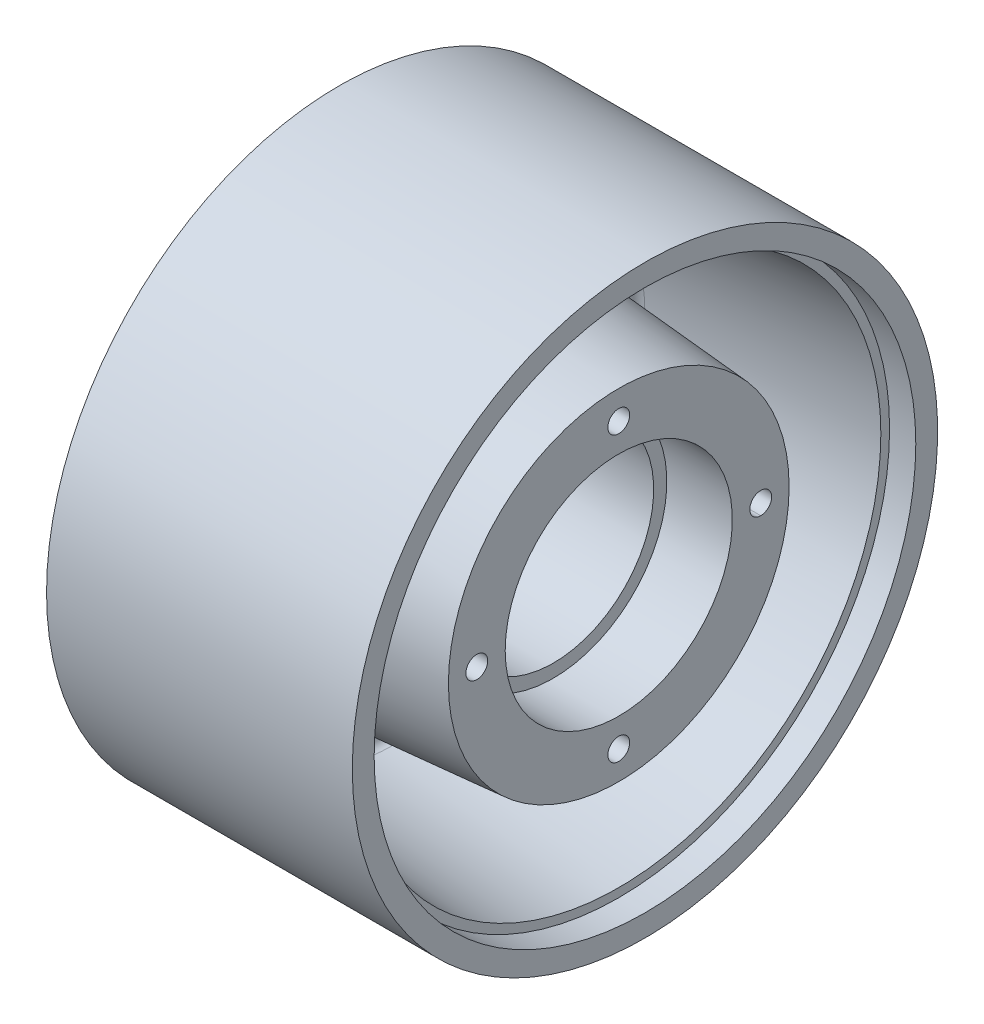
ISO-10303-21;
HEADER;
FILE_DESCRIPTION(('STEP AP214'),'2;1');
FILE_NAME('part.step','',(''),(''),'','','');
FILE_SCHEMA(('AUTOMOTIVE_DESIGN { 1 0 10303 214 1 1 1 1 }'));
ENDSEC;
DATA;
#1=APPLICATION_CONTEXT('core data for automotive mechanical design processes');
#2=APPLICATION_PROTOCOL_DEFINITION('international standard','automotive_design',2000,#1);
#3=PRODUCT_CONTEXT('',#1,'mechanical');
#4=PRODUCT('Part','Part','',(#3));
#5=PRODUCT_RELATED_PRODUCT_CATEGORY('part','',(#4));
#6=PRODUCT_DEFINITION_FORMATION('','',#4);
#7=PRODUCT_DEFINITION_CONTEXT('part definition',#1,'design');
#8=PRODUCT_DEFINITION('design','',#6,#7);
#9=PRODUCT_DEFINITION_SHAPE('','',#8);
#10=(LENGTH_UNIT() NAMED_UNIT(*) SI_UNIT(.MILLI.,.METRE.));
#11=(NAMED_UNIT(*) PLANE_ANGLE_UNIT() SI_UNIT($,.RADIAN.));
#12=(NAMED_UNIT(*) SI_UNIT($,.STERADIAN.) SOLID_ANGLE_UNIT());
#13=UNCERTAINTY_MEASURE_WITH_UNIT(LENGTH_MEASURE(1.E-05),#10,'distance_accuracy_value','');
#14=(GEOMETRIC_REPRESENTATION_CONTEXT(3) GLOBAL_UNCERTAINTY_ASSIGNED_CONTEXT((#13)) GLOBAL_UNIT_ASSIGNED_CONTEXT((#10,
#11,#12)) REPRESENTATION_CONTEXT('',''));
#15=CARTESIAN_POINT('',(0.,0.,0.));
#16=DIRECTION('',(0.,0.,1.));
#17=DIRECTION('',(1.,0.,0.));
#18=AXIS2_PLACEMENT_3D('',#15,#16,#17);
#19=CARTESIAN_POINT('',(64.,39.,0.));
#20=DIRECTION('',(-1.,0.,0.));
#21=DIRECTION('',(0.,0.,1.));
#22=AXIS2_PLACEMENT_3D('',#19,#20,#21);
#23=PLANE('',#22);
#24=CARTESIAN_POINT('',(64.,0.,0.));
#25=DIRECTION('',(-1.,0.,0.));
#26=DIRECTION('',(0.,0.,1.));
#27=AXIS2_PLACEMENT_3D('',#24,#25,#26);
#28=CIRCLE('',#27,26.);
#29=CARTESIAN_POINT('',(64.,0.,26.));
#30=VERTEX_POINT('',#29);
#31=EDGE_CURVE('E281',#30,#30,#28,.T.);
#32=ORIENTED_EDGE('',*,*,#31,.T.);
#33=EDGE_LOOP('',(#32));
#34=FACE_BOUND('',#33,.T.);
#35=CARTESIAN_POINT('',(64.,0.,0.));
#36=DIRECTION('',(-1.,0.,0.));
#37=DIRECTION('',(0.,0.,1.));
#38=AXIS2_PLACEMENT_3D('',#35,#36,#37);
#39=CIRCLE('',#38,39.);
#40=CARTESIAN_POINT('',(64.,0.,39.));
#41=VERTEX_POINT('',#40);
#42=EDGE_CURVE('E283',#41,#41,#39,.T.);
#43=ORIENTED_EDGE('',*,*,#42,.F.);
#44=EDGE_LOOP('',(#43));
#45=FACE_BOUND('',#44,.T.);
#46=CARTESIAN_POINT('',(64.,32.5,0.));
#47=DIRECTION('',(1.,0.,0.));
#48=DIRECTION('',(0.,0.,-1.));
#49=AXIS2_PLACEMENT_3D('',#46,#47,#48);
#50=CIRCLE('',#49,2.49999999999999);
#51=CARTESIAN_POINT('',(64.,32.5,-2.49999999999999));
#52=VERTEX_POINT('',#51);
#53=EDGE_CURVE('E248',#52,#52,#50,.T.);
#54=ORIENTED_EDGE('',*,*,#53,.F.);
#55=EDGE_LOOP('',(#54));
#56=FACE_BOUND('',#55,.T.);
#57=CARTESIAN_POINT('',(64.,-32.4705621886959,0.));
#58=DIRECTION('',(1.,0.,0.));
#59=DIRECTION('',(0.,0.,-1.));
#60=AXIS2_PLACEMENT_3D('',#57,#58,#59);
#61=CIRCLE('',#60,2.49999999999999);
#62=CARTESIAN_POINT('',(64.,-32.4705621886959,-2.49999999999999));
#63=VERTEX_POINT('',#62);
#64=EDGE_CURVE('E242',#63,#63,#61,.T.);
#65=ORIENTED_EDGE('',*,*,#64,.F.);
#66=EDGE_LOOP('',(#65));
#67=FACE_BOUND('',#66,.T.);
#68=CARTESIAN_POINT('',(64.,0.,32.5));
#69=DIRECTION('',(1.,0.,0.));
#70=DIRECTION('',(0.,0.,-1.));
#71=AXIS2_PLACEMENT_3D('',#68,#69,#70);
#72=CIRCLE('',#71,2.49999999999999);
#73=CARTESIAN_POINT('',(64.,0.,30.));
#74=VERTEX_POINT('',#73);
#75=EDGE_CURVE('E122',#74,#74,#72,.T.);
#76=ORIENTED_EDGE('',*,*,#75,.F.);
#77=EDGE_LOOP('',(#76));
#78=FACE_BOUND('',#77,.T.);
#79=CARTESIAN_POINT('',(64.,0.,-32.5));
#80=DIRECTION('',(1.,0.,0.));
#81=DIRECTION('',(0.,0.,-1.));
#82=AXIS2_PLACEMENT_3D('',#79,#80,#81);
#83=CIRCLE('',#82,2.49999999999999);
#84=CARTESIAN_POINT('',(64.,2.4999998565431,-32.5008469264674));
#85=VERTEX_POINT('',#84);
#86=CARTESIAN_POINT('',(64.,-2.4999998565431,-32.5008469264674));
#87=VERTEX_POINT('',#86);
#88=EDGE_CURVE('E110',#85,#87,#83,.T.);
#89=ORIENTED_EDGE('',*,*,#88,.F.);
#90=CARTESIAN_POINT('',(64.,0.,-32.5016938529361));
#91=DIRECTION('',(1.,0.,0.));
#92=DIRECTION('',(0.,0.,-1.));
#93=AXIS2_PLACEMENT_3D('',#90,#91,#92);
#94=CIRCLE('',#93,2.49999999999999);
#95=EDGE_CURVE('E222',#87,#85,#94,.T.);
#96=ORIENTED_EDGE('',*,*,#95,.F.);
#97=EDGE_LOOP('',(#89,#96));
#98=FACE_BOUND('',#97,.T.);
#99=ADVANCED_FACE('F38',(#34,#45,#56,#67,#78,#98),#23,.F.);
#100=CARTESIAN_POINT('',(70.,67.,0.));
#101=DIRECTION('',(-1.,0.,0.));
#102=DIRECTION('',(0.,0.,1.));
#103=AXIS2_PLACEMENT_3D('',#100,#101,#102);
#104=PLANE('',#103);
#105=CARTESIAN_POINT('',(70.,0.,0.));
#106=DIRECTION('',(-1.,0.,0.));
#107=DIRECTION('',(0.,0.,1.));
#108=AXIS2_PLACEMENT_3D('',#105,#106,#107);
#109=CIRCLE('',#108,67.);
#110=CARTESIAN_POINT('',(70.,0.,67.));
#111=VERTEX_POINT('',#110);
#112=EDGE_CURVE('E254',#111,#111,#109,.T.);
#113=ORIENTED_EDGE('',*,*,#112,.F.);
#114=EDGE_LOOP('',(#113));
#115=FACE_BOUND('',#114,.T.);
#116=CARTESIAN_POINT('',(70.,0.,0.));
#117=DIRECTION('',(-1.,0.,0.));
#118=DIRECTION('',(0.,0.,1.));
#119=AXIS2_PLACEMENT_3D('',#116,#117,#118);
#120=CIRCLE('',#119,62.);
#121=CARTESIAN_POINT('',(70.,0.,62.));
#122=VERTEX_POINT('',#121);
#123=EDGE_CURVE('E212',#122,#122,#120,.T.);
#124=ORIENTED_EDGE('',*,*,#123,.T.);
#125=EDGE_LOOP('',(#124));
#126=FACE_BOUND('',#125,.T.);
#127=ADVANCED_FACE('F154',(#115,#126),#104,.F.);
#128=CARTESIAN_POINT('',(-33.5154853004459,0.,0.));
#129=DIRECTION('',(-1.,0.,0.));
#130=DIRECTION('',(0.,0.,1.));
#131=AXIS2_PLACEMENT_3D('',#128,#129,#130);
#132=CYLINDRICAL_SURFACE('',#131,62.);
#133=ORIENTED_EDGE('',*,*,#123,.F.);
#134=EDGE_LOOP('',(#133));
#135=FACE_BOUND('',#134,.T.);
#136=CARTESIAN_POINT('',(64.,0.,0.));
#137=DIRECTION('',(-1.,0.,0.));
#138=DIRECTION('',(0.,0.,1.));
#139=AXIS2_PLACEMENT_3D('',#136,#137,#138);
#140=CIRCLE('',#139,62.);
#141=CARTESIAN_POINT('',(64.,0.,62.));
#142=VERTEX_POINT('',#141);
#143=EDGE_CURVE('E289',#142,#142,#140,.T.);
#144=ORIENTED_EDGE('',*,*,#143,.T.);
#145=EDGE_LOOP('',(#144));
#146=FACE_BOUND('',#145,.T.);
#147=ADVANCED_FACE('F160',(#135,#146),#132,.F.);
#148=CARTESIAN_POINT('',(64.,62.,0.));
#149=DIRECTION('',(-1.,0.,0.));
#150=DIRECTION('',(0.,0.,1.));
#151=AXIS2_PLACEMENT_3D('',#148,#149,#150);
#152=PLANE('',#151);
#153=ORIENTED_EDGE('',*,*,#143,.F.);
#154=EDGE_LOOP('',(#153));
#155=FACE_BOUND('',#154,.T.);
#156=CARTESIAN_POINT('',(64.,0.,0.));
#157=DIRECTION('',(-1.,0.,0.));
#158=DIRECTION('',(0.,0.,1.));
#159=AXIS2_PLACEMENT_3D('',#156,#157,#158);
#160=CIRCLE('',#159,60.);
#161=CARTESIAN_POINT('',(64.,0.,60.));
#162=VERTEX_POINT('',#161);
#163=EDGE_CURVE('E286',#162,#162,#160,.T.);
#164=ORIENTED_EDGE('',*,*,#163,.T.);
#165=EDGE_LOOP('',(#164));
#166=FACE_BOUND('',#165,.T.);
#167=ADVANCED_FACE('F180',(#155,#166),#152,.F.);
#168=CARTESIAN_POINT('',(12.,0.,0.));
#169=DIRECTION('',(1.,0.,0.));
#170=DIRECTION('',(0.,0.,-1.));
#171=AXIS2_PLACEMENT_3D('',#168,#169,#170);
#172=CONICAL_SURFACE('',#171,56.,0.0767718912697781);
#173=CARTESIAN_POINT('',(13.8466070022305,0.,0.));
#174=DIRECTION('',(1.,0.,0.));
#175=DIRECTION('',(0.,0.,-1.));
#176=AXIS2_PLACEMENT_3D('',#173,#174,#175);
#177=CIRCLE('',#176,56.1420466924793);
#178=CARTESIAN_POINT('',(13.8466070022305,0.,-56.1420466924793));
#179=VERTEX_POINT('',#178);
#180=EDGE_CURVE('E209',#179,#179,#177,.F.);
#181=ORIENTED_EDGE('',*,*,#180,.T.);
#182=EDGE_LOOP('',(#181));
#183=FACE_BOUND('',#182,.T.);
#184=ORIENTED_EDGE('',*,*,#163,.F.);
#185=EDGE_LOOP('',(#184));
#186=FACE_BOUND('',#185,.T.);
#187=ADVANCED_FACE('F176',(#183,#186),#172,.F.);
#188=CARTESIAN_POINT('',(12.,56.,0.));
#189=DIRECTION('',(-1.,0.,0.));
#190=DIRECTION('',(0.,0.,1.));
#191=AXIS2_PLACEMENT_3D('',#188,#189,#190);
#192=PLANE('',#191);
#193=CARTESIAN_POINT('',(12.,0.,0.));
#194=DIRECTION('',(-1.,0.,0.));
#195=DIRECTION('',(0.,0.,1.));
#196=AXIS2_PLACEMENT_3D('',#193,#194,#195);
#197=CIRCLE('',#196,44.8520622785239);
#198=CARTESIAN_POINT('',(12.,0.,44.8520622785239));
#199=VERTEX_POINT('',#198);
#200=EDGE_CURVE('E206',#199,#199,#197,.T.);
#201=ORIENTED_EDGE('',*,*,#200,.T.);
#202=EDGE_LOOP('',(#201));
#203=FACE_BOUND('',#202,.T.);
#204=CARTESIAN_POINT('',(12.,0.,0.));
#205=DIRECTION('',(-1.,0.,0.));
#206=DIRECTION('',(0.,0.,1.));
#207=AXIS2_PLACEMENT_3D('',#204,#205,#206);
#208=CIRCLE('',#207,54.1479377214761);
#209=CARTESIAN_POINT('',(12.,0.,54.1479377214761));
#210=VERTEX_POINT('',#209);
#211=EDGE_CURVE('E207',#210,#210,#208,.F.);
#212=ORIENTED_EDGE('',*,*,#211,.T.);
#213=EDGE_LOOP('',(#212));
#214=FACE_BOUND('',#213,.T.);
#215=ADVANCED_FACE('F172',(#203,#214),#192,.F.);
#216=CARTESIAN_POINT('',(64.,0.,0.));
#217=DIRECTION('',(-1.,0.,0.));
#218=DIRECTION('',(0.,0.,1.));
#219=AXIS2_PLACEMENT_3D('',#216,#217,#218);
#220=CONICAL_SURFACE('',#219,39.,0.076771891269778);
#221=CARTESIAN_POINT('',(13.8466070022305,0.,0.));
#222=DIRECTION('',(-1.,0.,0.));
#223=DIRECTION('',(0.,0.,1.));
#224=AXIS2_PLACEMENT_3D('',#221,#222,#223);
#225=CIRCLE('',#224,42.8579533075207);
#226=CARTESIAN_POINT('',(13.8466070022305,0.,42.8579533075207));
#227=VERTEX_POINT('',#226);
#228=EDGE_CURVE('E203',#227,#227,#225,.F.);
#229=ORIENTED_EDGE('',*,*,#228,.T.);
#230=EDGE_LOOP('',(#229));
#231=FACE_BOUND('',#230,.T.);
#232=ORIENTED_EDGE('',*,*,#42,.T.);
#233=EDGE_LOOP('',(#232));
#234=FACE_BOUND('',#233,.T.);
#235=ADVANCED_FACE('F169',(#231,#234),#220,.T.);
#236=CARTESIAN_POINT('',(-33.5154853004459,0.,0.));
#237=DIRECTION('',(-1.,0.,0.));
#238=DIRECTION('',(0.,0.,1.));
#239=AXIS2_PLACEMENT_3D('',#236,#237,#238);
#240=CYLINDRICAL_SURFACE('',#239,26.);
#241=ORIENTED_EDGE('',*,*,#31,.F.);
#242=EDGE_LOOP('',(#241));
#243=FACE_BOUND('',#242,.T.);
#244=CARTESIAN_POINT('',(49.,0.,0.));
#245=DIRECTION('',(-1.,0.,0.));
#246=DIRECTION('',(0.,0.,1.));
#247=AXIS2_PLACEMENT_3D('',#244,#245,#246);
#248=CIRCLE('',#247,26.);
#249=CARTESIAN_POINT('',(49.,0.,26.));
#250=VERTEX_POINT('',#249);
#251=EDGE_CURVE('E278',#250,#250,#248,.T.);
#252=ORIENTED_EDGE('',*,*,#251,.T.);
#253=EDGE_LOOP('',(#252));
#254=FACE_BOUND('',#253,.T.);
#255=ADVANCED_FACE('F167',(#243,#254),#240,.F.);
#256=CARTESIAN_POINT('',(49.,23.,0.));
#257=DIRECTION('',(-1.,0.,0.));
#258=DIRECTION('',(0.,0.,1.));
#259=AXIS2_PLACEMENT_3D('',#256,#257,#258);
#260=PLANE('',#259);
#261=ORIENTED_EDGE('',*,*,#251,.F.);
#262=EDGE_LOOP('',(#261));
#263=FACE_BOUND('',#262,.T.);
#264=CARTESIAN_POINT('',(49.,0.,0.));
#265=DIRECTION('',(-1.,0.,0.));
#266=DIRECTION('',(0.,0.,1.));
#267=AXIS2_PLACEMENT_3D('',#264,#265,#266);
#268=CIRCLE('',#267,23.);
#269=CARTESIAN_POINT('',(49.,0.,23.));
#270=VERTEX_POINT('',#269);
#271=EDGE_CURVE('E275',#270,#270,#268,.T.);
#272=ORIENTED_EDGE('',*,*,#271,.T.);
#273=EDGE_LOOP('',(#272));
#274=FACE_BOUND('',#273,.T.);
#275=ADVANCED_FACE('F633',(#263,#274),#260,.F.);
#276=CARTESIAN_POINT('',(-33.5154853004459,0.,0.));
#277=DIRECTION('',(-1.,0.,0.));
#278=DIRECTION('',(0.,0.,1.));
#279=AXIS2_PLACEMENT_3D('',#276,#277,#278);
#280=CYLINDRICAL_SURFACE('',#279,23.);
#281=ORIENTED_EDGE('',*,*,#271,.F.);
#282=EDGE_LOOP('',(#281));
#283=FACE_BOUND('',#282,.T.);
#284=CARTESIAN_POINT('',(25.,0.,0.));
#285=DIRECTION('',(-1.,0.,0.));
#286=DIRECTION('',(0.,0.,1.));
#287=AXIS2_PLACEMENT_3D('',#284,#285,#286);
#288=CIRCLE('',#287,23.);
#289=CARTESIAN_POINT('',(25.,0.,23.));
#290=VERTEX_POINT('',#289);
#291=EDGE_CURVE('E272',#290,#290,#288,.T.);
#292=ORIENTED_EDGE('',*,*,#291,.T.);
#293=EDGE_LOOP('',(#292));
#294=FACE_BOUND('',#293,.T.);
#295=ADVANCED_FACE('F624',(#283,#294),#280,.F.);
#296=CARTESIAN_POINT('',(25.,26.,0.));
#297=DIRECTION('',(1.,0.,0.));
#298=DIRECTION('',(0.,0.,-1.));
#299=AXIS2_PLACEMENT_3D('',#296,#297,#298);
#300=PLANE('',#299);
#301=ORIENTED_EDGE('',*,*,#291,.F.);
#302=EDGE_LOOP('',(#301));
#303=FACE_BOUND('',#302,.T.);
#304=CARTESIAN_POINT('',(25.,0.,0.));
#305=DIRECTION('',(-1.,0.,0.));
#306=DIRECTION('',(0.,0.,1.));
#307=AXIS2_PLACEMENT_3D('',#304,#305,#306);
#308=CIRCLE('',#307,26.);
#309=CARTESIAN_POINT('',(25.,0.,26.));
#310=VERTEX_POINT('',#309);
#311=EDGE_CURVE('E269',#310,#310,#308,.T.);
#312=ORIENTED_EDGE('',*,*,#311,.T.);
#313=EDGE_LOOP('',(#312));
#314=FACE_BOUND('',#313,.T.);
#315=ADVANCED_FACE('F616',(#303,#314),#300,.F.);
#316=CARTESIAN_POINT('',(-33.5154853004459,0.,0.));
#317=DIRECTION('',(-1.,0.,0.));
#318=DIRECTION('',(0.,0.,1.));
#319=AXIS2_PLACEMENT_3D('',#316,#317,#318);
#320=CYLINDRICAL_SURFACE('',#319,26.);
#321=ORIENTED_EDGE('',*,*,#311,.F.);
#322=EDGE_LOOP('',(#321));
#323=FACE_BOUND('',#322,.T.);
#324=CARTESIAN_POINT('',(10.,0.,0.));
#325=DIRECTION('',(-1.,0.,0.));
#326=DIRECTION('',(0.,0.,1.));
#327=AXIS2_PLACEMENT_3D('',#324,#325,#326);
#328=CIRCLE('',#327,26.);
#329=CARTESIAN_POINT('',(10.,0.,26.));
#330=VERTEX_POINT('',#329);
#331=EDGE_CURVE('E266',#330,#330,#328,.T.);
#332=ORIENTED_EDGE('',*,*,#331,.T.);
#333=EDGE_LOOP('',(#332));
#334=FACE_BOUND('',#333,.T.);
#335=ADVANCED_FACE('F362',(#323,#334),#320,.F.);
#336=CARTESIAN_POINT('',(10.,26.,0.));
#337=DIRECTION('',(1.,0.,0.));
#338=DIRECTION('',(0.,0.,-1.));
#339=AXIS2_PLACEMENT_3D('',#336,#337,#338);
#340=PLANE('',#339);
#341=CARTESIAN_POINT('',(10.,0.,-32.4977936784822));
#342=DIRECTION('',(-1.,0.,0.));
#343=DIRECTION('',(0.,0.,1.));
#344=AXIS2_PLACEMENT_3D('',#341,#342,#343);
#345=CIRCLE('',#344,2.49999999999999);
#346=CARTESIAN_POINT('',(10.,0.,-29.9977936784822));
#347=VERTEX_POINT('',#346);
#348=EDGE_CURVE('E100',#347,#347,#345,.T.);
#349=ORIENTED_EDGE('',*,*,#348,.F.);
#350=EDGE_LOOP('',(#349));
#351=FACE_BOUND('',#350,.T.);
#352=CARTESIAN_POINT('',(10.,0.,32.4975181220993));
#353=DIRECTION('',(-1.,0.,0.));
#354=DIRECTION('',(0.,0.,1.));
#355=AXIS2_PLACEMENT_3D('',#352,#353,#354);
#356=CIRCLE('',#355,2.49999999999999);
#357=CARTESIAN_POINT('',(10.,0.,34.9975181220993));
#358=VERTEX_POINT('',#357);
#359=EDGE_CURVE('E99',#358,#358,#356,.T.);
#360=ORIENTED_EDGE('',*,*,#359,.F.);
#361=EDGE_LOOP('',(#360));
#362=FACE_BOUND('',#361,.T.);
#363=CARTESIAN_POINT('',(10.,-32.5001914104075,0.));
#364=DIRECTION('',(-1.,0.,0.));
#365=DIRECTION('',(0.,0.,1.));
#366=AXIS2_PLACEMENT_3D('',#363,#364,#365);
#367=CIRCLE('',#366,2.49999999999999);
#368=CARTESIAN_POINT('',(10.,-32.5001914104075,2.49999999999999));
#369=VERTEX_POINT('',#368);
#370=EDGE_CURVE('E226',#369,#369,#367,.T.);
#371=ORIENTED_EDGE('',*,*,#370,.F.);
#372=EDGE_LOOP('',(#371));
#373=FACE_BOUND('',#372,.T.);
#374=CARTESIAN_POINT('',(10.,32.4982135014541,0.));
#375=DIRECTION('',(-1.,0.,0.));
#376=DIRECTION('',(0.,0.,1.));
#377=AXIS2_PLACEMENT_3D('',#374,#375,#376);
#378=CIRCLE('',#377,2.49999999999999);
#379=CARTESIAN_POINT('',(10.,32.4982135014541,2.49999999999999));
#380=VERTEX_POINT('',#379);
#381=EDGE_CURVE('E236',#380,#380,#378,.T.);
#382=ORIENTED_EDGE('',*,*,#381,.F.);
#383=EDGE_LOOP('',(#382));
#384=FACE_BOUND('',#383,.T.);
#385=ORIENTED_EDGE('',*,*,#331,.F.);
#386=EDGE_LOOP('',(#385));
#387=FACE_BOUND('',#386,.T.);
#388=CARTESIAN_POINT('',(10.,0.,0.));
#389=DIRECTION('',(-1.,0.,0.));
#390=DIRECTION('',(0.,0.,1.));
#391=AXIS2_PLACEMENT_3D('',#388,#389,#390);
#392=CIRCLE('',#391,40.);
#393=CARTESIAN_POINT('',(10.,0.,40.));
#394=VERTEX_POINT('',#393);
#395=EDGE_CURVE('E263',#394,#394,#392,.T.);
#396=ORIENTED_EDGE('',*,*,#395,.T.);
#397=EDGE_LOOP('',(#396));
#398=FACE_BOUND('',#397,.T.);
#399=ADVANCED_FACE('F357',(#351,#362,#373,#384,#387,#398),#340,.F.);
#400=CARTESIAN_POINT('',(-33.5154853004459,0.,0.));
#401=DIRECTION('',(-1.,0.,0.));
#402=DIRECTION('',(0.,0.,1.));
#403=AXIS2_PLACEMENT_3D('',#400,#401,#402);
#404=CYLINDRICAL_SURFACE('',#403,40.);
#405=ORIENTED_EDGE('',*,*,#395,.F.);
#406=EDGE_LOOP('',(#405));
#407=FACE_BOUND('',#406,.T.);
#408=CARTESIAN_POINT('',(0.,0.,0.));
#409=DIRECTION('',(-1.,0.,0.));
#410=DIRECTION('',(0.,0.,1.));
#411=AXIS2_PLACEMENT_3D('',#408,#409,#410);
#412=CIRCLE('',#411,40.);
#413=CARTESIAN_POINT('',(0.,0.,40.));
#414=VERTEX_POINT('',#413);
#415=EDGE_CURVE('E260',#414,#414,#412,.T.);
#416=ORIENTED_EDGE('',*,*,#415,.T.);
#417=EDGE_LOOP('',(#416));
#418=FACE_BOUND('',#417,.T.);
#419=ADVANCED_FACE('F361',(#407,#418),#404,.F.);
#420=CARTESIAN_POINT('',(0.,40.,0.));
#421=DIRECTION('',(1.,0.,0.));
#422=DIRECTION('',(0.,0.,-1.));
#423=AXIS2_PLACEMENT_3D('',#420,#421,#422);
#424=PLANE('',#423);
#425=ORIENTED_EDGE('',*,*,#415,.F.);
#426=EDGE_LOOP('',(#425));
#427=FACE_BOUND('',#426,.T.);
#428=CARTESIAN_POINT('',(0.,0.,0.));
#429=DIRECTION('',(-1.,0.,0.));
#430=DIRECTION('',(0.,0.,1.));
#431=AXIS2_PLACEMENT_3D('',#428,#429,#430);
#432=CIRCLE('',#431,67.);
#433=CARTESIAN_POINT('',(0.,0.,67.));
#434=VERTEX_POINT('',#433);
#435=EDGE_CURVE('E257',#434,#434,#432,.T.);
#436=ORIENTED_EDGE('',*,*,#435,.T.);
#437=EDGE_LOOP('',(#436));
#438=FACE_BOUND('',#437,.T.);
#439=ADVANCED_FACE('F197',(#427,#438),#424,.F.);
#440=CARTESIAN_POINT('',(-33.5154853004459,0.,0.));
#441=DIRECTION('',(-1.,0.,0.));
#442=DIRECTION('',(0.,0.,1.));
#443=AXIS2_PLACEMENT_3D('',#440,#441,#442);
#444=CYLINDRICAL_SURFACE('',#443,67.);
#445=ORIENTED_EDGE('',*,*,#435,.F.);
#446=EDGE_LOOP('',(#445));
#447=FACE_BOUND('',#446,.T.);
#448=ORIENTED_EDGE('',*,*,#112,.T.);
#449=EDGE_LOOP('',(#448));
#450=FACE_BOUND('',#449,.T.);
#451=ADVANCED_FACE('F189',(#447,#450),#444,.T.);
#452=CARTESIAN_POINT('',(14.,0.,0.));
#453=DIRECTION('',(-1.,0.,0.));
#454=DIRECTION('',(0.,0.,1.));
#455=AXIS2_PLACEMENT_3D('',#452,#453,#454);
#456=TOROIDAL_SURFACE('',#455,44.8520622785239,2.);
#457=ORIENTED_EDGE('',*,*,#228,.F.);
#458=EDGE_LOOP('',(#457));
#459=FACE_BOUND('',#458,.T.);
#460=ORIENTED_EDGE('',*,*,#200,.F.);
#461=EDGE_LOOP('',(#460));
#462=FACE_BOUND('',#461,.T.);
#463=ADVANCED_FACE('F187',(#459,#462),#456,.F.);
#464=CARTESIAN_POINT('',(14.,0.,0.));
#465=DIRECTION('',(-1.,0.,0.));
#466=DIRECTION('',(0.,0.,1.));
#467=AXIS2_PLACEMENT_3D('',#464,#465,#466);
#468=TOROIDAL_SURFACE('',#467,54.1479377214761,2.);
#469=ORIENTED_EDGE('',*,*,#211,.F.);
#470=EDGE_LOOP('',(#469));
#471=FACE_BOUND('',#470,.T.);
#472=ORIENTED_EDGE('',*,*,#180,.F.);
#473=EDGE_LOOP('',(#472));
#474=FACE_BOUND('',#473,.T.);
#475=ADVANCED_FACE('F40',(#471,#474),#468,.F.);
#476=CARTESIAN_POINT('',(46.,32.5,0.));
#477=DIRECTION('',(1.,0.,0.));
#478=DIRECTION('',(0.,0.,-1.));
#479=AXIS2_PLACEMENT_3D('',#476,#477,#478);
#480=CONICAL_SURFACE('',#479,2.5,1.02974425867665);
#481=CARTESIAN_POINT('',(44.4978484524311,32.5,0.));
#482=VERTEX_POINT('',#481);
#483=VERTEX_LOOP('',#482);
#484=FACE_BOUND('',#483,.T.);
#485=CARTESIAN_POINT('',(46.,32.5,0.));
#486=DIRECTION('',(1.,0.,0.));
#487=DIRECTION('',(0.,0.,-1.));
#488=AXIS2_PLACEMENT_3D('',#485,#486,#487);
#489=CIRCLE('',#488,2.5);
#490=CARTESIAN_POINT('',(46.,32.5,-2.5));
#491=VERTEX_POINT('',#490);
#492=EDGE_CURVE('E251',#491,#491,#489,.T.);
#493=ORIENTED_EDGE('',*,*,#492,.T.);
#494=EDGE_LOOP('',(#493));
#495=FACE_BOUND('',#494,.T.);
#496=ADVANCED_FACE('F195',(#484,#495),#480,.F.);
#497=CARTESIAN_POINT('',(64.,32.5,0.));
#498=DIRECTION('',(1.,0.,0.));
#499=DIRECTION('',(0.,0.,-1.));
#500=AXIS2_PLACEMENT_3D('',#497,#498,#499);
#501=CYLINDRICAL_SURFACE('',#500,2.49999999999999);
#502=ORIENTED_EDGE('',*,*,#492,.F.);
#503=EDGE_LOOP('',(#502));
#504=FACE_BOUND('',#503,.T.);
#505=ORIENTED_EDGE('',*,*,#53,.T.);
#506=EDGE_LOOP('',(#505));
#507=FACE_BOUND('',#506,.T.);
#508=ADVANCED_FACE('F427',(#504,#507),#501,.F.);
#509=CARTESIAN_POINT('',(46.,-32.4705621886959,0.));
#510=DIRECTION('',(1.,0.,0.));
#511=DIRECTION('',(0.,0.,-1.));
#512=AXIS2_PLACEMENT_3D('',#509,#510,#511);
#513=CONICAL_SURFACE('',#512,2.5,1.02974425867665);
#514=CARTESIAN_POINT('',(44.4978484524311,-32.4705621886959,0.));
#515=VERTEX_POINT('',#514);
#516=VERTEX_LOOP('',#515);
#517=FACE_BOUND('',#516,.T.);
#518=CARTESIAN_POINT('',(46.,-32.4705621886959,0.));
#519=DIRECTION('',(1.,0.,0.));
#520=DIRECTION('',(0.,0.,-1.));
#521=AXIS2_PLACEMENT_3D('',#518,#519,#520);
#522=CIRCLE('',#521,2.5);
#523=CARTESIAN_POINT('',(46.,-32.4705621886959,-2.5));
#524=VERTEX_POINT('',#523);
#525=EDGE_CURVE('E245',#524,#524,#522,.T.);
#526=ORIENTED_EDGE('',*,*,#525,.T.);
#527=EDGE_LOOP('',(#526));
#528=FACE_BOUND('',#527,.T.);
#529=ADVANCED_FACE('F437',(#517,#528),#513,.F.);
#530=CARTESIAN_POINT('',(64.,-32.4705621886959,0.));
#531=DIRECTION('',(1.,0.,0.));
#532=DIRECTION('',(0.,0.,-1.));
#533=AXIS2_PLACEMENT_3D('',#530,#531,#532);
#534=CYLINDRICAL_SURFACE('',#533,2.49999999999999);
#535=ORIENTED_EDGE('',*,*,#525,.F.);
#536=EDGE_LOOP('',(#535));
#537=FACE_BOUND('',#536,.T.);
#538=ORIENTED_EDGE('',*,*,#64,.T.);
#539=EDGE_LOOP('',(#538));
#540=FACE_BOUND('',#539,.T.);
#541=ADVANCED_FACE('F449',(#537,#540),#534,.F.);
#542=CARTESIAN_POINT('',(25.,32.4982135014541,0.));
#543=DIRECTION('',(-1.,0.,0.));
#544=DIRECTION('',(0.,0.,1.));
#545=AXIS2_PLACEMENT_3D('',#542,#543,#544);
#546=CONICAL_SURFACE('',#545,2.5,1.02974425867665);
#547=CARTESIAN_POINT('',(26.5021515475689,32.4982135014541,0.));
#548=VERTEX_POINT('',#547);
#549=VERTEX_LOOP('',#548);
#550=FACE_BOUND('',#549,.T.);
#551=CARTESIAN_POINT('',(25.,32.4982135014541,0.));
#552=DIRECTION('',(-1.,0.,0.));
#553=DIRECTION('',(0.,0.,1.));
#554=AXIS2_PLACEMENT_3D('',#551,#552,#553);
#555=CIRCLE('',#554,2.5);
#556=CARTESIAN_POINT('',(25.,32.4982135014541,2.5));
#557=VERTEX_POINT('',#556);
#558=EDGE_CURVE('E239',#557,#557,#555,.T.);
#559=ORIENTED_EDGE('',*,*,#558,.T.);
#560=EDGE_LOOP('',(#559));
#561=FACE_BOUND('',#560,.T.);
#562=ADVANCED_FACE('F459',(#550,#561),#546,.F.);
#563=CARTESIAN_POINT('',(10.,32.4982135014541,0.));
#564=DIRECTION('',(-1.,0.,0.));
#565=DIRECTION('',(0.,0.,1.));
#566=AXIS2_PLACEMENT_3D('',#563,#564,#565);
#567=CYLINDRICAL_SURFACE('',#566,2.49999999999999);
#568=ORIENTED_EDGE('',*,*,#558,.F.);
#569=EDGE_LOOP('',(#568));
#570=FACE_BOUND('',#569,.T.);
#571=ORIENTED_EDGE('',*,*,#381,.T.);
#572=EDGE_LOOP('',(#571));
#573=FACE_BOUND('',#572,.T.);
#574=ADVANCED_FACE('F471',(#570,#573),#567,.F.);
#575=CARTESIAN_POINT('',(25.,-32.5001914104075,0.));
#576=DIRECTION('',(-1.,0.,0.));
#577=DIRECTION('',(0.,0.,1.));
#578=AXIS2_PLACEMENT_3D('',#575,#576,#577);
#579=CONICAL_SURFACE('',#578,2.5,1.02974425867665);
#580=CARTESIAN_POINT('',(26.5021515475689,-32.5001914104075,0.));
#581=VERTEX_POINT('',#580);
#582=VERTEX_LOOP('',#581);
#583=FACE_BOUND('',#582,.T.);
#584=CARTESIAN_POINT('',(25.,-32.5001914104075,0.));
#585=DIRECTION('',(-1.,0.,0.));
#586=DIRECTION('',(0.,0.,1.));
#587=AXIS2_PLACEMENT_3D('',#584,#585,#586);
#588=CIRCLE('',#587,2.5);
#589=CARTESIAN_POINT('',(25.,-32.5001914104075,2.5));
#590=VERTEX_POINT('',#589);
#591=EDGE_CURVE('E229',#590,#590,#588,.T.);
#592=ORIENTED_EDGE('',*,*,#591,.T.);
#593=EDGE_LOOP('',(#592));
#594=FACE_BOUND('',#593,.T.);
#595=ADVANCED_FACE('F482',(#583,#594),#579,.F.);
#596=CARTESIAN_POINT('',(10.,-32.5001914104075,0.));
#597=DIRECTION('',(-1.,0.,0.));
#598=DIRECTION('',(0.,0.,1.));
#599=AXIS2_PLACEMENT_3D('',#596,#597,#598);
#600=CYLINDRICAL_SURFACE('',#599,2.49999999999999);
#601=ORIENTED_EDGE('',*,*,#591,.F.);
#602=EDGE_LOOP('',(#601));
#603=FACE_BOUND('',#602,.T.);
#604=ORIENTED_EDGE('',*,*,#370,.T.);
#605=EDGE_LOOP('',(#604));
#606=FACE_BOUND('',#605,.T.);
#607=ADVANCED_FACE('F150',(#603,#606),#600,.F.);
#608=CARTESIAN_POINT('',(46.,0.,-32.5016938529361));
#609=DIRECTION('',(1.,0.,0.));
#610=DIRECTION('',(0.,0.,-1.));
#611=AXIS2_PLACEMENT_3D('',#608,#609,#610);
#612=CONICAL_SURFACE('',#611,2.5,1.02974425867665);
#613=CARTESIAN_POINT('',(44.4978484524311,0.,-32.5016938529361));
#614=VERTEX_POINT('',#613);
#615=VERTEX_LOOP('',#614);
#616=FACE_BOUND('',#615,.T.);
#617=CARTESIAN_POINT('',(46.,0.,-32.5016938529361));
#618=DIRECTION('',(1.,0.,0.));
#619=DIRECTION('',(0.,0.,-1.));
#620=AXIS2_PLACEMENT_3D('',#617,#618,#619);
#621=CIRCLE('',#620,2.5);
#622=CARTESIAN_POINT('',(46.,-2.4999998565431,-32.5008469264667));
#623=VERTEX_POINT('',#622);
#624=CARTESIAN_POINT('',(46.,2.4999998565431,-32.5008469264719));
#625=VERTEX_POINT('',#624);
#626=EDGE_CURVE('E220',#623,#625,#621,.T.);
#627=ORIENTED_EDGE('',*,*,#626,.T.);
#628=CARTESIAN_POINT('',(46.0001202583145,2.5002,-32.5008469264673));
#629=CARTESIAN_POINT('',(45.7581625192802,2.09751421048349,-32.5008469264676));
#630=CARTESIAN_POINT('',(45.5162043282731,1.69482845902747,-32.5008469264677));
#631=CARTESIAN_POINT('',(45.1491985168165,1.08402829798021,-32.5008469264678));
#632=CARTESIAN_POINT('',(45.0241508015834,0.875913912484578,-32.5008469264678));
#633=CARTESIAN_POINT('',(44.8344766124867,0.560242674571603,-32.500846926468));
#634=CARTESIAN_POINT('',(44.7698500544963,0.452685835766926,-32.500846926468));
#635=CARTESIAN_POINT('',(44.6718233853276,0.289541774206601,-32.500846926468));
#636=CARTESIAN_POINT('',(44.6384233000636,0.233954598324496,-32.5008469264679));
#637=CARTESIAN_POINT('',(44.5877619961744,0.14963885515215,-32.500846926468));
#638=CARTESIAN_POINT('',(44.5705005181494,0.120910350921107,-32.500846926468));
#639=CARTESIAN_POINT('',(44.544317998943,0.0773339576068438,-32.500846926468));
#640=CARTESIAN_POINT('',(44.5353969151053,0.0624862310308814,-32.500846926468));
#641=CARTESIAN_POINT('',(44.5218666043205,0.0399640339060976,-32.500846926468));
#642=CARTESIAN_POINT('',(44.5172566175399,0.0322898180977104,-32.500846926468));
#643=CARTESIAN_POINT('',(44.510264623395,0.0206474623896877,-32.500846926468));
#644=CARTESIAN_POINT('',(44.5078821443941,0.0166799031882113,-32.500846926468));
#645=CARTESIAN_POINT('',(44.5042723905971,0.0106582763464023,-32.500846926468));
#646=CARTESIAN_POINT('',(44.5030427320552,0.00860520138119402,-32.500846926468));
#647=CARTESIAN_POINT('',(44.5011808679251,0.00548376217712623,-32.500846926468));
#648=CARTESIAN_POINT('',(44.5005462241869,0.00441750066849565,-32.500846926468));
#649=CARTESIAN_POINT('',(44.499596650544,0.00278665003703693,-32.500846926468));
#650=CARTESIAN_POINT('',(44.4992738461412,0.00222578198694012,-32.500846926468));
#651=CARTESIAN_POINT('',(44.4987965274893,0.00134215008642977,-32.500846926468));
#652=CARTESIAN_POINT('',(44.4986319222729,0.00102640721512014,-32.5008469264681));
#653=CARTESIAN_POINT('',(44.4984702135148,0.000598282101445845,-32.500846926468));
#654=CARTESIAN_POINT('',(44.498437187063,0.000500775136922579,-32.500846926468));
#655=CARTESIAN_POINT('',(44.4983861894875,0.00030271750361429,-32.500846926468));
#656=CARTESIAN_POINT('',(44.498368041881,0.000202217617376534,-32.500846926468));
#657=CARTESIAN_POINT('',(44.4983537057099,-2.18638347016547E-06,-32.500846926468));
#658=CARTESIAN_POINT('',(44.4983578656616,-0.00010611916427129,-32.500846926468));
#659=CARTESIAN_POINT('',(44.4983873152953,-0.000311710106690835,-32.500846926468));
#660=CARTESIAN_POINT('',(44.4984128522549,-0.000413327286984993,-32.500846926468));
#661=CARTESIAN_POINT('',(44.4985430299533,-0.000837906067101583,-32.500846926468));
#662=CARTESIAN_POINT('',(44.4986962348188,-0.0011435440692918,-32.500846926468));
#663=CARTESIAN_POINT('',(44.4990143101116,-0.00174810289503759,-32.500846926468));
#664=CARTESIAN_POINT('',(44.4991792551054,-0.00204696124242263,-32.500846926468));
#665=CARTESIAN_POINT('',(44.5000057823344,-0.0035194439083159,-32.500846926468));
#666=CARTESIAN_POINT('',(44.5006994545697,-0.0046773700044274,-32.500846926468));
#667=CARTESIAN_POINT('',(44.5020799023087,-0.00698749925276264,-32.500846926468));
#668=CARTESIAN_POINT('',(44.5027666949429,-0.0081397014568764,-32.500846926468));
#669=CARTESIAN_POINT('',(44.5062089948683,-0.0139042331657448,-32.500846926468));
#670=CARTESIAN_POINT('',(44.5089789862177,-0.0185094117849205,-32.500846926468));
#671=CARTESIAN_POINT('',(44.5145208222201,-0.0277313687732126,-32.500846926468));
#672=CARTESIAN_POINT('',(44.5172926579203,-0.0323481506853403,-32.500846926468));
#673=CARTESIAN_POINT('',(44.5311470909245,-0.0554194951935056,-32.500846926468));
#674=CARTESIAN_POINT('',(44.5422361666523,-0.073870877098392,-32.500846926468));
#675=CARTESIAN_POINT('',(44.5644015797515,-0.110757921191734,-32.500846926468));
#676=CARTESIAN_POINT('',(44.5754779194934,-0.129193582313272,-32.500846926468));
#677=CARTESIAN_POINT('',(44.6308697298007,-0.221386624713653,-32.500846926468));
#678=CARTESIAN_POINT('',(44.6751881170568,-0.295142579454384,-32.5008469264679));
#679=CARTESIAN_POINT('',(44.7638458449387,-0.442692243711868,-32.5008469264679));
#680=CARTESIAN_POINT('',(44.8081851848842,-0.516485953547764,-32.500846926468));
#681=CARTESIAN_POINT('',(45.0439257396045,-0.908826755374503,-32.5008469264682));
#682=CARTESIAN_POINT('',(45.2353282713659,-1.22737320380907,-32.500846926468));
#683=CARTESIAN_POINT('',(45.6178610698729,-1.86401288397678,-32.5008469264674));
#684=CARTESIAN_POINT('',(45.8089913365603,-2.18210611574512,-32.500846926467));
#685=CARTESIAN_POINT('',(46.0001202583145,-2.5002,-32.500846926467));
#686=B_SPLINE_CURVE_WITH_KNOTS('',3,(#628,#629,#630,#631,#632,#633,#634,#635,#636,#637,#638,
#639,#640,#641,#642,#643,#644,#645,#646,#647,#648,#649,#650,#651,#652,#653,#654,#655,#656,#657,
#658,#659,#660,#661,#662,#663,#664,#665,#666,#667,#668,#669,#670,#671,#672,#673,#674,#675,#676,
#677,#678,#679,#680,#681,#682,#683,#684,#685),.UNSPECIFIED.,.F.,.F.,(4,2,2,2,2,2,2,2,2,2,2,2,2,
2,2,2,2,2,2,2,2,2,2,2,2,2,2,2,4),(0.,1.40935997994936,2.1377394887491,2.51417760293664,
2.7087269502532,2.80927349784624,2.86123826974885,2.88809589751549,2.90197908014881,
2.90915942704963,2.91288061872238,2.91482382306656,2.91588829102327,2.91619657268557,
2.91650114254617,2.91681048450251,2.91712345501561,2.91814181639173,2.91916735066538,
2.92321294217975,2.92723788957702,2.94335829031924,2.95951356259075,3.02409439651673,
3.08861613003522,3.34675630417859,3.60502639779635,4.71990783641978,5.83320314745604),.UNSPECIFIED.);
#687=EDGE_CURVE('E113',#625,#623,#686,.T.);
#688=ORIENTED_EDGE('',*,*,#687,.T.);
#689=EDGE_LOOP('',(#627,#688));
#690=FACE_BOUND('',#689,.T.);
#691=ADVANCED_FACE('F124',(#616,#690),#612,.F.);
#692=CARTESIAN_POINT('',(64.,0.,-32.5016938529361));
#693=DIRECTION('',(1.,0.,0.));
#694=DIRECTION('',(0.,0.,-1.));
#695=AXIS2_PLACEMENT_3D('',#692,#693,#694);
#696=CYLINDRICAL_SURFACE('',#695,2.49999999999999);
#697=ORIENTED_EDGE('',*,*,#626,.F.);
#698=DIRECTION('',(1.,0.,0.));
#699=VECTOR('',#698,1.);
#700=CARTESIAN_POINT('',(55.,-2.4999998565431,-32.5008469264674));
#701=LINE('',#700,#699);
#702=EDGE_CURVE('E11',#623,#87,#701,.T.);
#703=ORIENTED_EDGE('',*,*,#702,.T.);
#704=ORIENTED_EDGE('',*,*,#95,.T.);
#705=DIRECTION('',(1.,0.,0.));
#706=VECTOR('',#705,1.);
#707=CARTESIAN_POINT('',(55.,2.4999998565431,-32.5008469264674));
#708=LINE('',#707,#706);
#709=EDGE_CURVE('E46',#85,#625,#708,.F.);
#710=ORIENTED_EDGE('',*,*,#709,.T.);
#711=EDGE_LOOP('',(#697,#703,#704,#710));
#712=FACE_BOUND('',#711,.T.);
#713=ADVANCED_FACE('F143',(#712),#696,.F.);
#714=CARTESIAN_POINT('',(46.,0.,32.5));
#715=DIRECTION('',(1.,0.,0.));
#716=DIRECTION('',(0.,0.,-1.));
#717=AXIS2_PLACEMENT_3D('',#714,#715,#716);
#718=CONICAL_SURFACE('',#717,2.5,1.02974425867665);
#719=CARTESIAN_POINT('',(44.4978484524311,0.,32.5));
#720=VERTEX_POINT('',#719);
#721=VERTEX_LOOP('',#720);
#722=FACE_BOUND('',#721,.T.);
#723=CARTESIAN_POINT('',(46.,0.,32.5));
#724=DIRECTION('',(1.,0.,0.));
#725=DIRECTION('',(0.,0.,-1.));
#726=AXIS2_PLACEMENT_3D('',#723,#724,#725);
#727=CIRCLE('',#726,2.5);
#728=CARTESIAN_POINT('',(46.,0.,30.));
#729=VERTEX_POINT('',#728);
#730=EDGE_CURVE('E231',#729,#729,#727,.T.);
#731=ORIENTED_EDGE('',*,*,#730,.T.);
#732=EDGE_LOOP('',(#731));
#733=FACE_BOUND('',#732,.T.);
#734=ADVANCED_FACE('F140',(#722,#733),#718,.F.);
#735=CARTESIAN_POINT('',(64.,0.,32.5));
#736=DIRECTION('',(1.,0.,0.));
#737=DIRECTION('',(0.,0.,-1.));
#738=AXIS2_PLACEMENT_3D('',#735,#736,#737);
#739=CYLINDRICAL_SURFACE('',#738,2.49999999999999);
#740=ORIENTED_EDGE('',*,*,#730,.F.);
#741=EDGE_LOOP('',(#740));
#742=FACE_BOUND('',#741,.T.);
#743=ORIENTED_EDGE('',*,*,#75,.T.);
#744=EDGE_LOOP('',(#743));
#745=FACE_BOUND('',#744,.T.);
#746=ADVANCED_FACE('F137',(#742,#745),#739,.F.);
#747=CARTESIAN_POINT('',(64.,0.,-32.5));
#748=DIRECTION('',(1.,0.,0.));
#749=DIRECTION('',(0.,0.,-1.));
#750=AXIS2_PLACEMENT_3D('',#747,#748,#749);
#751=CYLINDRICAL_SURFACE('',#750,2.49999999999999);
#752=CARTESIAN_POINT('',(46.,0.,-32.5));
#753=DIRECTION('',(1.,0.,0.));
#754=DIRECTION('',(0.,0.,-1.));
#755=AXIS2_PLACEMENT_3D('',#752,#753,#754);
#756=CIRCLE('',#755,2.5);
#757=EDGE_CURVE('E52',#625,#623,#756,.T.);
#758=ORIENTED_EDGE('',*,*,#757,.F.);
#759=ORIENTED_EDGE('',*,*,#709,.F.);
#760=ORIENTED_EDGE('',*,*,#88,.T.);
#761=ORIENTED_EDGE('',*,*,#702,.F.);
#762=EDGE_LOOP('',(#758,#759,#760,#761));
#763=FACE_BOUND('',#762,.T.);
#764=ADVANCED_FACE('F134',(#763),#751,.F.);
#765=CARTESIAN_POINT('',(46.,0.,-32.5));
#766=DIRECTION('',(1.,0.,0.));
#767=DIRECTION('',(0.,0.,-1.));
#768=AXIS2_PLACEMENT_3D('',#765,#766,#767);
#769=CONICAL_SURFACE('',#768,2.5,1.02974425867665);
#770=CARTESIAN_POINT('',(44.4978484524311,0.,-32.5));
#771=VERTEX_POINT('',#770);
#772=VERTEX_LOOP('',#771);
#773=FACE_BOUND('',#772,.T.);
#774=ORIENTED_EDGE('',*,*,#757,.T.);
#775=ORIENTED_EDGE('',*,*,#687,.F.);
#776=EDGE_LOOP('',(#774,#775));
#777=FACE_BOUND('',#776,.T.);
#778=ADVANCED_FACE('F128',(#773,#777),#769,.F.);
#779=CARTESIAN_POINT('',(25.,0.,32.4975181220993));
#780=DIRECTION('',(-1.,0.,0.));
#781=DIRECTION('',(0.,0.,1.));
#782=AXIS2_PLACEMENT_3D('',#779,#780,#781);
#783=CONICAL_SURFACE('',#782,2.5,1.02974425867665);
#784=CARTESIAN_POINT('',(26.5021515475689,0.,32.4975181220993));
#785=VERTEX_POINT('',#784);
#786=VERTEX_LOOP('',#785);
#787=FACE_BOUND('',#786,.T.);
#788=CARTESIAN_POINT('',(25.,0.,32.4975181220993));
#789=DIRECTION('',(-1.,0.,0.));
#790=DIRECTION('',(0.,0.,1.));
#791=AXIS2_PLACEMENT_3D('',#788,#789,#790);
#792=CIRCLE('',#791,2.5);
#793=CARTESIAN_POINT('',(25.,0.,34.9975181220993));
#794=VERTEX_POINT('',#793);
#795=EDGE_CURVE('E103',#794,#794,#792,.T.);
#796=ORIENTED_EDGE('',*,*,#795,.T.);
#797=EDGE_LOOP('',(#796));
#798=FACE_BOUND('',#797,.T.);
#799=ADVANCED_FACE('F133',(#787,#798),#783,.F.);
#800=CARTESIAN_POINT('',(10.,0.,32.4975181220993));
#801=DIRECTION('',(-1.,0.,0.));
#802=DIRECTION('',(0.,0.,1.));
#803=AXIS2_PLACEMENT_3D('',#800,#801,#802);
#804=CYLINDRICAL_SURFACE('',#803,2.49999999999999);
#805=ORIENTED_EDGE('',*,*,#795,.F.);
#806=EDGE_LOOP('',(#805));
#807=FACE_BOUND('',#806,.T.);
#808=ORIENTED_EDGE('',*,*,#359,.T.);
#809=EDGE_LOOP('',(#808));
#810=FACE_BOUND('',#809,.T.);
#811=ADVANCED_FACE('F93',(#807,#810),#804,.F.);
#812=CARTESIAN_POINT('',(25.,0.,-32.4977936784822));
#813=DIRECTION('',(-1.,0.,0.));
#814=DIRECTION('',(0.,0.,1.));
#815=AXIS2_PLACEMENT_3D('',#812,#813,#814);
#816=CONICAL_SURFACE('',#815,2.5,1.02974425867665);
#817=CARTESIAN_POINT('',(26.5021515475689,0.,-32.4977936784822));
#818=VERTEX_POINT('',#817);
#819=VERTEX_LOOP('',#818);
#820=FACE_BOUND('',#819,.T.);
#821=CARTESIAN_POINT('',(25.,0.,-32.4977936784822));
#822=DIRECTION('',(-1.,0.,0.));
#823=DIRECTION('',(0.,0.,1.));
#824=AXIS2_PLACEMENT_3D('',#821,#822,#823);
#825=CIRCLE('',#824,2.5);
#826=CARTESIAN_POINT('',(25.,0.,-29.9977936784822));
#827=VERTEX_POINT('',#826);
#828=EDGE_CURVE('E97',#827,#827,#825,.T.);
#829=ORIENTED_EDGE('',*,*,#828,.T.);
#830=EDGE_LOOP('',(#829));
#831=FACE_BOUND('',#830,.T.);
#832=ADVANCED_FACE('F89',(#820,#831),#816,.F.);
#833=CARTESIAN_POINT('',(10.,0.,-32.4977936784822));
#834=DIRECTION('',(-1.,0.,0.));
#835=DIRECTION('',(0.,0.,1.));
#836=AXIS2_PLACEMENT_3D('',#833,#834,#835);
#837=CYLINDRICAL_SURFACE('',#836,2.49999999999999);
#838=ORIENTED_EDGE('',*,*,#828,.F.);
#839=EDGE_LOOP('',(#838));
#840=FACE_BOUND('',#839,.T.);
#841=ORIENTED_EDGE('',*,*,#348,.T.);
#842=EDGE_LOOP('',(#841));
#843=FACE_BOUND('',#842,.T.);
#844=ADVANCED_FACE('F92',(#840,#843),#837,.F.);
#845=CLOSED_SHELL('',(#99,#127,#147,#167,#187,#215,#235,#255,#275,#295,#315,#335,#399,#419,#439,
#451,#463,#475,#496,#508,#529,#541,#562,#574,#595,#607,#691,#713,#734,#746,#764,#778,#799,#811,
#832,#844));
#846=MANIFOLD_SOLID_BREP('B2',#845);
#847=ADVANCED_BREP_SHAPE_REPRESENTATION('',(#18,#846),#14);
#848=SHAPE_DEFINITION_REPRESENTATION(#9,#847);
ENDSEC;
END-ISO-10303-21;
